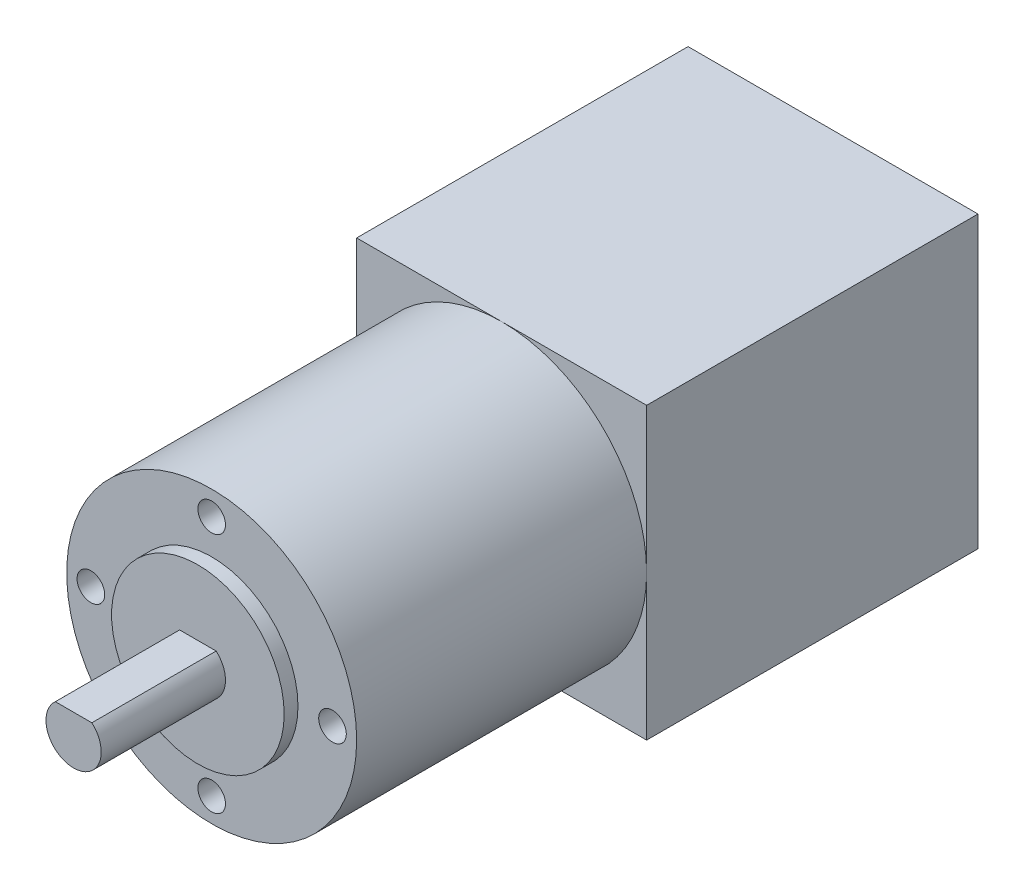
ISO-10303-21;
HEADER;
FILE_DESCRIPTION(('STEP AP214'),'2;1');
FILE_NAME('part.step','',(''),(''),'','','');
FILE_SCHEMA(('AUTOMOTIVE_DESIGN { 1 0 10303 214 1 1 1 1 }'));
ENDSEC;
DATA;
#1=APPLICATION_CONTEXT('core data for automotive mechanical design processes');
#2=APPLICATION_PROTOCOL_DEFINITION('international standard','automotive_design',2000,#1);
#3=PRODUCT_CONTEXT('',#1,'mechanical');
#4=PRODUCT('Part','Part','',(#3));
#5=PRODUCT_RELATED_PRODUCT_CATEGORY('part','',(#4));
#6=PRODUCT_DEFINITION_FORMATION('','',#4);
#7=PRODUCT_DEFINITION_CONTEXT('part definition',#1,'design');
#8=PRODUCT_DEFINITION('design','',#6,#7);
#9=PRODUCT_DEFINITION_SHAPE('','',#8);
#10=(LENGTH_UNIT() NAMED_UNIT(*) SI_UNIT(.MILLI.,.METRE.));
#11=(NAMED_UNIT(*) PLANE_ANGLE_UNIT() SI_UNIT($,.RADIAN.));
#12=(NAMED_UNIT(*) SI_UNIT($,.STERADIAN.) SOLID_ANGLE_UNIT());
#13=UNCERTAINTY_MEASURE_WITH_UNIT(LENGTH_MEASURE(1.E-05),#10,'distance_accuracy_value','');
#14=(GEOMETRIC_REPRESENTATION_CONTEXT(3) GLOBAL_UNCERTAINTY_ASSIGNED_CONTEXT((#13)) GLOBAL_UNIT_ASSIGNED_CONTEXT((#10,
#11,#12)) REPRESENTATION_CONTEXT('',''));
#15=CARTESIAN_POINT('',(0.,0.,0.));
#16=DIRECTION('',(0.,0.,1.));
#17=DIRECTION('',(1.,0.,0.));
#18=AXIS2_PLACEMENT_3D('',#15,#16,#17);
#19=CARTESIAN_POINT('',(0.,0.,48.));
#20=DIRECTION('',(0.,0.,1.));
#21=DIRECTION('',(1.,0.,0.));
#22=AXIS2_PLACEMENT_3D('',#19,#20,#21);
#23=PLANE('',#22);
#24=CARTESIAN_POINT('',(0.,0.,48.));
#25=DIRECTION('',(0.,0.,1.));
#26=DIRECTION('',(1.,0.,0.));
#27=AXIS2_PLACEMENT_3D('',#24,#25,#26);
#28=CIRCLE('',#27,21.);
#29=CARTESIAN_POINT('',(21.,0.,48.));
#30=VERTEX_POINT('',#29);
#31=CARTESIAN_POINT('',(0.,21.,48.));
#32=VERTEX_POINT('',#31);
#33=EDGE_CURVE('E120',#30,#32,#28,.T.);
#34=ORIENTED_EDGE('',*,*,#33,.F.);
#35=DIRECTION('',(0.,1.,0.));
#36=VECTOR('',#35,1.);
#37=CARTESIAN_POINT('',(21.,21.,48.));
#38=LINE('',#37,#36);
#39=CARTESIAN_POINT('',(21.,21.,48.));
#40=VERTEX_POINT('',#39);
#41=EDGE_CURVE('E134',#30,#40,#38,.T.);
#42=ORIENTED_EDGE('',*,*,#41,.T.);
#43=DIRECTION('',(-1.,0.,0.));
#44=VECTOR('',#43,1.);
#45=CARTESIAN_POINT('',(-21.,21.,48.));
#46=LINE('',#45,#44);
#47=EDGE_CURVE('E135',#40,#32,#46,.T.);
#48=ORIENTED_EDGE('',*,*,#47,.T.);
#49=EDGE_LOOP('',(#34,#42,#48));
#50=FACE_BOUND('',#49,.T.);
#51=ADVANCED_FACE('F34',(#50),#23,.T.);
#52=CARTESIAN_POINT('',(-21.,0.,48.));
#53=VERTEX_POINT('',#52);
#54=EDGE_CURVE('E43',#32,#53,#28,.T.);
#55=ORIENTED_EDGE('',*,*,#54,.F.);
#56=CARTESIAN_POINT('',(-21.,21.,48.));
#57=VERTEX_POINT('',#56);
#58=EDGE_CURVE('E133',#32,#57,#46,.T.);
#59=ORIENTED_EDGE('',*,*,#58,.T.);
#60=DIRECTION('',(0.,-1.,0.));
#61=VECTOR('',#60,1.);
#62=CARTESIAN_POINT('',(-21.,21.,48.));
#63=LINE('',#62,#61);
#64=EDGE_CURVE('E139',#57,#53,#63,.T.);
#65=ORIENTED_EDGE('',*,*,#64,.T.);
#66=EDGE_LOOP('',(#55,#59,#65));
#67=FACE_BOUND('',#66,.T.);
#68=ADVANCED_FACE('F177',(#67),#23,.T.);
#69=CARTESIAN_POINT('',(0.,-21.,48.));
#70=VERTEX_POINT('',#69);
#71=EDGE_CURVE('E169',#53,#70,#28,.T.);
#72=ORIENTED_EDGE('',*,*,#71,.F.);
#73=CARTESIAN_POINT('',(-21.,-21.,48.));
#74=VERTEX_POINT('',#73);
#75=EDGE_CURVE('E138',#53,#74,#63,.T.);
#76=ORIENTED_EDGE('',*,*,#75,.T.);
#77=DIRECTION('',(1.,0.,0.));
#78=VECTOR('',#77,1.);
#79=CARTESIAN_POINT('',(-21.,-21.,48.));
#80=LINE('',#79,#78);
#81=EDGE_CURVE('E143',#74,#70,#80,.T.);
#82=ORIENTED_EDGE('',*,*,#81,.T.);
#83=EDGE_LOOP('',(#72,#76,#82));
#84=FACE_BOUND('',#83,.T.);
#85=ADVANCED_FACE('F195',(#84),#23,.T.);
#86=CARTESIAN_POINT('',(21.,21.,48.));
#87=DIRECTION('',(-1.,0.,0.));
#88=DIRECTION('',(0.,-1.,0.));
#89=AXIS2_PLACEMENT_3D('',#86,#87,#88);
#90=PLANE('',#89);
#91=DIRECTION('',(0.,1.,0.));
#92=VECTOR('',#91,1.);
#93=CARTESIAN_POINT('',(21.,21.,0.));
#94=LINE('',#93,#92);
#95=CARTESIAN_POINT('',(21.,-21.,0.));
#96=VERTEX_POINT('',#95);
#97=CARTESIAN_POINT('',(21.,21.,0.));
#98=VERTEX_POINT('',#97);
#99=EDGE_CURVE('E128',#96,#98,#94,.T.);
#100=ORIENTED_EDGE('',*,*,#99,.T.);
#101=DIRECTION('',(0.,0.,-1.));
#102=VECTOR('',#101,1.);
#103=CARTESIAN_POINT('',(21.,21.,48.));
#104=LINE('',#103,#102);
#105=EDGE_CURVE('E38',#40,#98,#104,.T.);
#106=ORIENTED_EDGE('',*,*,#105,.F.);
#107=ORIENTED_EDGE('',*,*,#41,.F.);
#108=CARTESIAN_POINT('',(21.,-21.,48.));
#109=VERTEX_POINT('',#108);
#110=EDGE_CURVE('E131',#109,#30,#38,.T.);
#111=ORIENTED_EDGE('',*,*,#110,.F.);
#112=DIRECTION('',(0.,0.,-1.));
#113=VECTOR('',#112,1.);
#114=CARTESIAN_POINT('',(21.,-21.,48.));
#115=LINE('',#114,#113);
#116=EDGE_CURVE('E146',#109,#96,#115,.T.);
#117=ORIENTED_EDGE('',*,*,#116,.T.);
#118=EDGE_LOOP('',(#100,#106,#107,#111,#117));
#119=FACE_BOUND('',#118,.T.);
#120=ADVANCED_FACE('F36',(#119),#90,.F.);
#121=CARTESIAN_POINT('',(-21.,21.,48.));
#122=DIRECTION('',(0.,-1.,0.));
#123=DIRECTION('',(0.,0.,-1.));
#124=AXIS2_PLACEMENT_3D('',#121,#122,#123);
#125=PLANE('',#124);
#126=DIRECTION('',(-1.,0.,0.));
#127=VECTOR('',#126,1.);
#128=CARTESIAN_POINT('',(-21.,21.,0.));
#129=LINE('',#128,#127);
#130=CARTESIAN_POINT('',(-21.,21.,0.));
#131=VERTEX_POINT('',#130);
#132=EDGE_CURVE('E149',#98,#131,#129,.T.);
#133=ORIENTED_EDGE('',*,*,#132,.T.);
#134=DIRECTION('',(0.,0.,-1.));
#135=VECTOR('',#134,1.);
#136=CARTESIAN_POINT('',(-21.,21.,48.));
#137=LINE('',#136,#135);
#138=EDGE_CURVE('E159',#57,#131,#137,.T.);
#139=ORIENTED_EDGE('',*,*,#138,.F.);
#140=ORIENTED_EDGE('',*,*,#58,.F.);
#141=ORIENTED_EDGE('',*,*,#47,.F.);
#142=ORIENTED_EDGE('',*,*,#105,.T.);
#143=EDGE_LOOP('',(#133,#139,#140,#141,#142));
#144=FACE_BOUND('',#143,.T.);
#145=ADVANCED_FACE('F178',(#144),#125,.F.);
#146=CARTESIAN_POINT('',(-21.,21.,48.));
#147=DIRECTION('',(1.,0.,0.));
#148=DIRECTION('',(0.,1.,0.));
#149=AXIS2_PLACEMENT_3D('',#146,#147,#148);
#150=PLANE('',#149);
#151=DIRECTION('',(0.,-1.,0.));
#152=VECTOR('',#151,1.);
#153=CARTESIAN_POINT('',(-21.,21.,0.));
#154=LINE('',#153,#152);
#155=CARTESIAN_POINT('',(-21.,-21.,0.));
#156=VERTEX_POINT('',#155);
#157=EDGE_CURVE('E151',#131,#156,#154,.T.);
#158=ORIENTED_EDGE('',*,*,#157,.T.);
#159=DIRECTION('',(0.,0.,-1.));
#160=VECTOR('',#159,1.);
#161=CARTESIAN_POINT('',(-21.,-21.,48.));
#162=LINE('',#161,#160);
#163=EDGE_CURVE('E157',#74,#156,#162,.T.);
#164=ORIENTED_EDGE('',*,*,#163,.F.);
#165=ORIENTED_EDGE('',*,*,#75,.F.);
#166=ORIENTED_EDGE('',*,*,#64,.F.);
#167=ORIENTED_EDGE('',*,*,#138,.T.);
#168=EDGE_LOOP('',(#158,#164,#165,#166,#167));
#169=FACE_BOUND('',#168,.T.);
#170=ADVANCED_FACE('F189',(#169),#150,.F.);
#171=CARTESIAN_POINT('',(-21.,-21.,48.));
#172=DIRECTION('',(0.,1.,0.));
#173=DIRECTION('',(0.,0.,1.));
#174=AXIS2_PLACEMENT_3D('',#171,#172,#173);
#175=PLANE('',#174);
#176=DIRECTION('',(1.,0.,0.));
#177=VECTOR('',#176,1.);
#178=CARTESIAN_POINT('',(-21.,-21.,0.));
#179=LINE('',#178,#177);
#180=EDGE_CURVE('E153',#156,#96,#179,.T.);
#181=ORIENTED_EDGE('',*,*,#180,.T.);
#182=ORIENTED_EDGE('',*,*,#116,.F.);
#183=EDGE_CURVE('E142',#70,#109,#80,.T.);
#184=ORIENTED_EDGE('',*,*,#183,.F.);
#185=ORIENTED_EDGE('',*,*,#81,.F.);
#186=ORIENTED_EDGE('',*,*,#163,.T.);
#187=EDGE_LOOP('',(#181,#182,#184,#185,#186));
#188=FACE_BOUND('',#187,.T.);
#189=ADVANCED_FACE('F193',(#188),#175,.F.);
#190=EDGE_CURVE('E58',#70,#30,#28,.T.);
#191=ORIENTED_EDGE('',*,*,#190,.F.);
#192=ORIENTED_EDGE('',*,*,#183,.T.);
#193=ORIENTED_EDGE('',*,*,#110,.T.);
#194=EDGE_LOOP('',(#191,#192,#193));
#195=FACE_BOUND('',#194,.T.);
#196=ADVANCED_FACE('F198',(#195),#23,.T.);
#197=CARTESIAN_POINT('',(0.,0.,0.));
#198=DIRECTION('',(0.,0.,1.));
#199=DIRECTION('',(1.,0.,0.));
#200=AXIS2_PLACEMENT_3D('',#197,#198,#199);
#201=PLANE('',#200);
#202=ORIENTED_EDGE('',*,*,#99,.F.);
#203=ORIENTED_EDGE('',*,*,#180,.F.);
#204=ORIENTED_EDGE('',*,*,#157,.F.);
#205=ORIENTED_EDGE('',*,*,#132,.F.);
#206=EDGE_LOOP('',(#202,#203,#204,#205));
#207=FACE_BOUND('',#206,.T.);
#208=ADVANCED_FACE('F187',(#207),#201,.F.);
#209=CARTESIAN_POINT('',(0.,0.,90.));
#210=DIRECTION('',(0.,0.,-1.));
#211=DIRECTION('',(-1.,0.,0.));
#212=AXIS2_PLACEMENT_3D('',#209,#210,#211);
#213=CYLINDRICAL_SURFACE('',#212,21.);
#214=CARTESIAN_POINT('',(0.,0.,90.));
#215=DIRECTION('',(0.,0.,1.));
#216=DIRECTION('',(1.,0.,0.));
#217=AXIS2_PLACEMENT_3D('',#214,#215,#216);
#218=CIRCLE('',#217,21.);
#219=CARTESIAN_POINT('',(21.,0.,90.));
#220=VERTEX_POINT('',#219);
#221=EDGE_CURVE('E125',#220,#220,#218,.T.);
#222=ORIENTED_EDGE('',*,*,#221,.F.);
#223=EDGE_LOOP('',(#222));
#224=FACE_BOUND('',#223,.T.);
#225=ORIENTED_EDGE('',*,*,#33,.T.);
#226=ORIENTED_EDGE('',*,*,#54,.T.);
#227=ORIENTED_EDGE('',*,*,#71,.T.);
#228=ORIENTED_EDGE('',*,*,#190,.T.);
#229=EDGE_LOOP('',(#225,#226,#227,#228));
#230=FACE_BOUND('',#229,.T.);
#231=ADVANCED_FACE('F173',(#224,#230),#213,.T.);
#232=CARTESIAN_POINT('',(0.,0.,90.));
#233=DIRECTION('',(0.,0.,1.));
#234=DIRECTION('',(1.,0.,0.));
#235=AXIS2_PLACEMENT_3D('',#232,#233,#234);
#236=PLANE('',#235);
#237=CARTESIAN_POINT('',(0.,-17.5,90.));
#238=DIRECTION('',(0.,0.,1.));
#239=DIRECTION('',(1.,0.,0.));
#240=AXIS2_PLACEMENT_3D('',#237,#238,#239);
#241=CIRCLE('',#240,2.);
#242=CARTESIAN_POINT('',(2.,-17.5,90.));
#243=VERTEX_POINT('',#242);
#244=EDGE_CURVE('E403',#243,#243,#241,.T.);
#245=ORIENTED_EDGE('',*,*,#244,.F.);
#246=EDGE_LOOP('',(#245));
#247=FACE_BOUND('',#246,.T.);
#248=CARTESIAN_POINT('',(-17.5,0.,90.));
#249=DIRECTION('',(0.,0.,1.));
#250=DIRECTION('',(1.,0.,0.));
#251=AXIS2_PLACEMENT_3D('',#248,#249,#250);
#252=CIRCLE('',#251,2.);
#253=CARTESIAN_POINT('',(-15.5,0.,90.));
#254=VERTEX_POINT('',#253);
#255=EDGE_CURVE('E412',#254,#254,#252,.T.);
#256=ORIENTED_EDGE('',*,*,#255,.F.);
#257=EDGE_LOOP('',(#256));
#258=FACE_BOUND('',#257,.T.);
#259=CARTESIAN_POINT('',(1.2220184685951E-13,17.5,90.));
#260=DIRECTION('',(0.,0.,1.));
#261=DIRECTION('',(1.,0.,0.));
#262=AXIS2_PLACEMENT_3D('',#259,#260,#261);
#263=CIRCLE('',#262,2.);
#264=CARTESIAN_POINT('',(2.00000000000012,17.5,90.));
#265=VERTEX_POINT('',#264);
#266=EDGE_CURVE('E418',#265,#265,#263,.T.);
#267=ORIENTED_EDGE('',*,*,#266,.F.);
#268=EDGE_LOOP('',(#267));
#269=FACE_BOUND('',#268,.T.);
#270=CARTESIAN_POINT('',(17.5,-1.83302770289265E-13,90.));
#271=DIRECTION('',(0.,0.,1.));
#272=DIRECTION('',(1.,0.,0.));
#273=AXIS2_PLACEMENT_3D('',#270,#271,#272);
#274=CIRCLE('',#273,2.);
#275=CARTESIAN_POINT('',(19.5,-1.83302770289265E-13,90.));
#276=VERTEX_POINT('',#275);
#277=EDGE_CURVE('E424',#276,#276,#274,.T.);
#278=ORIENTED_EDGE('',*,*,#277,.F.);
#279=EDGE_LOOP('',(#278));
#280=FACE_BOUND('',#279,.T.);
#281=CARTESIAN_POINT('',(0.,0.,90.));
#282=DIRECTION('',(0.,0.,1.));
#283=DIRECTION('',(1.,0.,0.));
#284=AXIS2_PLACEMENT_3D('',#281,#282,#283);
#285=CIRCLE('',#284,12.5);
#286=CARTESIAN_POINT('',(12.5,0.,90.));
#287=VERTEX_POINT('',#286);
#288=EDGE_CURVE('E11',#287,#287,#285,.T.);
#289=ORIENTED_EDGE('',*,*,#288,.F.);
#290=EDGE_LOOP('',(#289));
#291=FACE_BOUND('',#290,.T.);
#292=ORIENTED_EDGE('',*,*,#221,.T.);
#293=EDGE_LOOP('',(#292));
#294=FACE_BOUND('',#293,.T.);
#295=ADVANCED_FACE('F264',(#247,#258,#269,#280,#291,#294),#236,.T.);
#296=CARTESIAN_POINT('',(0.,0.,92.));
#297=DIRECTION('',(0.,0.,-1.));
#298=DIRECTION('',(-1.,0.,0.));
#299=AXIS2_PLACEMENT_3D('',#296,#297,#298);
#300=CYLINDRICAL_SURFACE('',#299,12.5);
#301=CARTESIAN_POINT('',(0.,0.,92.));
#302=DIRECTION('',(0.,0.,1.));
#303=DIRECTION('',(1.,0.,0.));
#304=AXIS2_PLACEMENT_3D('',#301,#302,#303);
#305=CIRCLE('',#304,12.5);
#306=CARTESIAN_POINT('',(12.5,0.,92.));
#307=VERTEX_POINT('',#306);
#308=EDGE_CURVE('E117',#307,#307,#305,.T.);
#309=ORIENTED_EDGE('',*,*,#308,.F.);
#310=EDGE_LOOP('',(#309));
#311=FACE_BOUND('',#310,.T.);
#312=ORIENTED_EDGE('',*,*,#288,.T.);
#313=EDGE_LOOP('',(#312));
#314=FACE_BOUND('',#313,.T.);
#315=ADVANCED_FACE('F271',(#311,#314),#300,.T.);
#316=CARTESIAN_POINT('',(0.,0.,92.));
#317=DIRECTION('',(0.,0.,1.));
#318=DIRECTION('',(1.,0.,0.));
#319=AXIS2_PLACEMENT_3D('',#316,#317,#318);
#320=PLANE('',#319);
#321=CARTESIAN_POINT('',(0.,0.,92.));
#322=DIRECTION('',(0.,0.,1.));
#323=DIRECTION('',(1.,0.,0.));
#324=AXIS2_PLACEMENT_3D('',#321,#322,#323);
#325=CIRCLE('',#324,4.);
#326=CARTESIAN_POINT('',(-2.64575131106459,3.,92.));
#327=VERTEX_POINT('',#326);
#328=CARTESIAN_POINT('',(2.64575131106459,3.,92.));
#329=VERTEX_POINT('',#328);
#330=EDGE_CURVE('E116',#327,#329,#325,.T.);
#331=ORIENTED_EDGE('',*,*,#330,.F.);
#332=DIRECTION('',(-1.,0.,0.));
#333=VECTOR('',#332,1.);
#334=CARTESIAN_POINT('',(-2.64575131106459,3.,92.));
#335=LINE('',#334,#333);
#336=EDGE_CURVE('E50',#329,#327,#335,.T.);
#337=ORIENTED_EDGE('',*,*,#336,.F.);
#338=EDGE_LOOP('',(#331,#337));
#339=FACE_BOUND('',#338,.T.);
#340=ORIENTED_EDGE('',*,*,#308,.T.);
#341=EDGE_LOOP('',(#340));
#342=FACE_BOUND('',#341,.T.);
#343=ADVANCED_FACE('F276',(#339,#342),#320,.T.);
#344=CARTESIAN_POINT('',(0.,0.,110.));
#345=DIRECTION('',(0.,0.,-1.));
#346=DIRECTION('',(-1.,0.,0.));
#347=AXIS2_PLACEMENT_3D('',#344,#345,#346);
#348=CYLINDRICAL_SURFACE('',#347,4.);
#349=ORIENTED_EDGE('',*,*,#330,.T.);
#350=DIRECTION('',(0.,0.,-1.));
#351=VECTOR('',#350,1.);
#352=CARTESIAN_POINT('',(2.64575131106459,3.,110.));
#353=LINE('',#352,#351);
#354=CARTESIAN_POINT('',(2.64575131106459,3.,110.));
#355=VERTEX_POINT('',#354);
#356=EDGE_CURVE('E104',#355,#329,#353,.T.);
#357=ORIENTED_EDGE('',*,*,#356,.F.);
#358=CARTESIAN_POINT('',(0.,0.,110.));
#359=DIRECTION('',(0.,0.,1.));
#360=DIRECTION('',(1.,0.,0.));
#361=AXIS2_PLACEMENT_3D('',#358,#359,#360);
#362=CIRCLE('',#361,4.);
#363=CARTESIAN_POINT('',(-2.64575131106459,3.,110.));
#364=VERTEX_POINT('',#363);
#365=EDGE_CURVE('E110',#364,#355,#362,.T.);
#366=ORIENTED_EDGE('',*,*,#365,.F.);
#367=DIRECTION('',(0.,0.,-1.));
#368=VECTOR('',#367,1.);
#369=CARTESIAN_POINT('',(-2.64575131106459,3.,110.));
#370=LINE('',#369,#368);
#371=EDGE_CURVE('E107',#364,#327,#370,.T.);
#372=ORIENTED_EDGE('',*,*,#371,.T.);
#373=EDGE_LOOP('',(#349,#357,#366,#372));
#374=FACE_BOUND('',#373,.T.);
#375=ADVANCED_FACE('F115',(#374),#348,.T.);
#376=CARTESIAN_POINT('',(-2.64575131106459,3.,110.));
#377=DIRECTION('',(0.,-1.,0.));
#378=DIRECTION('',(0.,0.,-1.));
#379=AXIS2_PLACEMENT_3D('',#376,#377,#378);
#380=PLANE('',#379);
#381=ORIENTED_EDGE('',*,*,#336,.T.);
#382=ORIENTED_EDGE('',*,*,#371,.F.);
#383=DIRECTION('',(-1.,0.,0.));
#384=VECTOR('',#383,1.);
#385=CARTESIAN_POINT('',(-2.64575131106459,3.,110.));
#386=LINE('',#385,#384);
#387=EDGE_CURVE('E100',#355,#364,#386,.T.);
#388=ORIENTED_EDGE('',*,*,#387,.F.);
#389=ORIENTED_EDGE('',*,*,#356,.T.);
#390=EDGE_LOOP('',(#381,#382,#388,#389));
#391=FACE_BOUND('',#390,.T.);
#392=ADVANCED_FACE('F102',(#391),#380,.F.);
#393=CARTESIAN_POINT('',(0.,0.,110.));
#394=DIRECTION('',(0.,0.,1.));
#395=DIRECTION('',(1.,0.,0.));
#396=AXIS2_PLACEMENT_3D('',#393,#394,#395);
#397=PLANE('',#396);
#398=ORIENTED_EDGE('',*,*,#365,.T.);
#399=ORIENTED_EDGE('',*,*,#387,.T.);
#400=EDGE_LOOP('',(#398,#399));
#401=FACE_BOUND('',#400,.T.);
#402=ADVANCED_FACE('F112',(#401),#397,.T.);
#403=CARTESIAN_POINT('',(17.5,-1.83302770289265E-13,86.));
#404=DIRECTION('',(0.,0.,1.));
#405=DIRECTION('',(1.,0.,0.));
#406=AXIS2_PLACEMENT_3D('',#403,#404,#405);
#407=CYLINDRICAL_SURFACE('',#406,2.);
#408=CARTESIAN_POINT('',(17.5,-1.83302770289265E-13,86.));
#409=DIRECTION('',(0.,0.,1.));
#410=DIRECTION('',(1.,0.,0.));
#411=AXIS2_PLACEMENT_3D('',#408,#409,#410);
#412=CIRCLE('',#411,2.);
#413=CARTESIAN_POINT('',(19.5,-1.83302770289265E-13,86.));
#414=VERTEX_POINT('',#413);
#415=EDGE_CURVE('E421',#414,#414,#412,.T.);
#416=ORIENTED_EDGE('',*,*,#415,.F.);
#417=EDGE_LOOP('',(#416));
#418=FACE_BOUND('',#417,.T.);
#419=ORIENTED_EDGE('',*,*,#277,.T.);
#420=EDGE_LOOP('',(#419));
#421=FACE_BOUND('',#420,.T.);
#422=ADVANCED_FACE('F310',(#418,#421),#407,.F.);
#423=CARTESIAN_POINT('',(17.5,-1.83302770289265E-13,86.));
#424=DIRECTION('',(0.,0.,1.));
#425=DIRECTION('',(1.,0.,0.));
#426=AXIS2_PLACEMENT_3D('',#423,#424,#425);
#427=PLANE('',#426);
#428=ORIENTED_EDGE('',*,*,#415,.T.);
#429=EDGE_LOOP('',(#428));
#430=FACE_BOUND('',#429,.T.);
#431=ADVANCED_FACE('F326',(#430),#427,.T.);
#432=CARTESIAN_POINT('',(1.2220184685951E-13,17.5,86.));
#433=DIRECTION('',(0.,0.,1.));
#434=DIRECTION('',(1.,0.,0.));
#435=AXIS2_PLACEMENT_3D('',#432,#433,#434);
#436=CYLINDRICAL_SURFACE('',#435,2.);
#437=CARTESIAN_POINT('',(1.2220184685951E-13,17.5,86.));
#438=DIRECTION('',(0.,0.,1.));
#439=DIRECTION('',(1.,0.,0.));
#440=AXIS2_PLACEMENT_3D('',#437,#438,#439);
#441=CIRCLE('',#440,2.);
#442=CARTESIAN_POINT('',(2.00000000000012,17.5,86.));
#443=VERTEX_POINT('',#442);
#444=EDGE_CURVE('E415',#443,#443,#441,.T.);
#445=ORIENTED_EDGE('',*,*,#444,.F.);
#446=EDGE_LOOP('',(#445));
#447=FACE_BOUND('',#446,.T.);
#448=ORIENTED_EDGE('',*,*,#266,.T.);
#449=EDGE_LOOP('',(#448));
#450=FACE_BOUND('',#449,.T.);
#451=ADVANCED_FACE('F336',(#447,#450),#436,.F.);
#452=CARTESIAN_POINT('',(1.2220184685951E-13,17.5,86.));
#453=DIRECTION('',(0.,0.,1.));
#454=DIRECTION('',(1.,0.,0.));
#455=AXIS2_PLACEMENT_3D('',#452,#453,#454);
#456=PLANE('',#455);
#457=ORIENTED_EDGE('',*,*,#444,.T.);
#458=EDGE_LOOP('',(#457));
#459=FACE_BOUND('',#458,.T.);
#460=ADVANCED_FACE('F346',(#459),#456,.T.);
#461=CARTESIAN_POINT('',(-17.5,0.,86.));
#462=DIRECTION('',(0.,0.,1.));
#463=DIRECTION('',(1.,0.,0.));
#464=AXIS2_PLACEMENT_3D('',#461,#462,#463);
#465=CYLINDRICAL_SURFACE('',#464,2.);
#466=CARTESIAN_POINT('',(-17.5,0.,86.));
#467=DIRECTION('',(0.,0.,1.));
#468=DIRECTION('',(1.,0.,0.));
#469=AXIS2_PLACEMENT_3D('',#466,#467,#468);
#470=CIRCLE('',#469,2.);
#471=CARTESIAN_POINT('',(-15.5,0.,86.));
#472=VERTEX_POINT('',#471);
#473=EDGE_CURVE('E407',#472,#472,#470,.T.);
#474=ORIENTED_EDGE('',*,*,#473,.F.);
#475=EDGE_LOOP('',(#474));
#476=FACE_BOUND('',#475,.T.);
#477=ORIENTED_EDGE('',*,*,#255,.T.);
#478=EDGE_LOOP('',(#477));
#479=FACE_BOUND('',#478,.T.);
#480=ADVANCED_FACE('F356',(#476,#479),#465,.F.);
#481=CARTESIAN_POINT('',(-17.5,0.,86.));
#482=DIRECTION('',(0.,0.,1.));
#483=DIRECTION('',(1.,0.,0.));
#484=AXIS2_PLACEMENT_3D('',#481,#482,#483);
#485=PLANE('',#484);
#486=ORIENTED_EDGE('',*,*,#473,.T.);
#487=EDGE_LOOP('',(#486));
#488=FACE_BOUND('',#487,.T.);
#489=ADVANCED_FACE('F366',(#488),#485,.T.);
#490=CARTESIAN_POINT('',(0.,-17.5,86.));
#491=DIRECTION('',(0.,0.,1.));
#492=DIRECTION('',(1.,0.,0.));
#493=AXIS2_PLACEMENT_3D('',#490,#491,#492);
#494=CYLINDRICAL_SURFACE('',#493,2.);
#495=CARTESIAN_POINT('',(0.,-17.5,86.));
#496=DIRECTION('',(0.,0.,1.));
#497=DIRECTION('',(1.,0.,0.));
#498=AXIS2_PLACEMENT_3D('',#495,#496,#497);
#499=CIRCLE('',#498,2.);
#500=CARTESIAN_POINT('',(2.,-17.5,86.));
#501=VERTEX_POINT('',#500);
#502=EDGE_CURVE('E402',#501,#501,#499,.T.);
#503=ORIENTED_EDGE('',*,*,#502,.F.);
#504=EDGE_LOOP('',(#503));
#505=FACE_BOUND('',#504,.T.);
#506=ORIENTED_EDGE('',*,*,#244,.T.);
#507=EDGE_LOOP('',(#506));
#508=FACE_BOUND('',#507,.T.);
#509=ADVANCED_FACE('F376',(#505,#508),#494,.F.);
#510=CARTESIAN_POINT('',(0.,-17.5,86.));
#511=DIRECTION('',(0.,0.,1.));
#512=DIRECTION('',(1.,0.,0.));
#513=AXIS2_PLACEMENT_3D('',#510,#511,#512);
#514=PLANE('',#513);
#515=ORIENTED_EDGE('',*,*,#502,.T.);
#516=EDGE_LOOP('',(#515));
#517=FACE_BOUND('',#516,.T.);
#518=ADVANCED_FACE('F386',(#517),#514,.T.);
#519=CLOSED_SHELL('',(#51,#68,#85,#120,#145,#170,#189,#196,#208,#231,#295,#315,#343,#375,#392,
#402,#422,#431,#451,#460,#480,#489,#509,#518));
#520=MANIFOLD_SOLID_BREP('B2',#519);
#521=ADVANCED_BREP_SHAPE_REPRESENTATION('',(#18,#520),#14);
#522=SHAPE_DEFINITION_REPRESENTATION(#9,#521);
ENDSEC;
END-ISO-10303-21;
